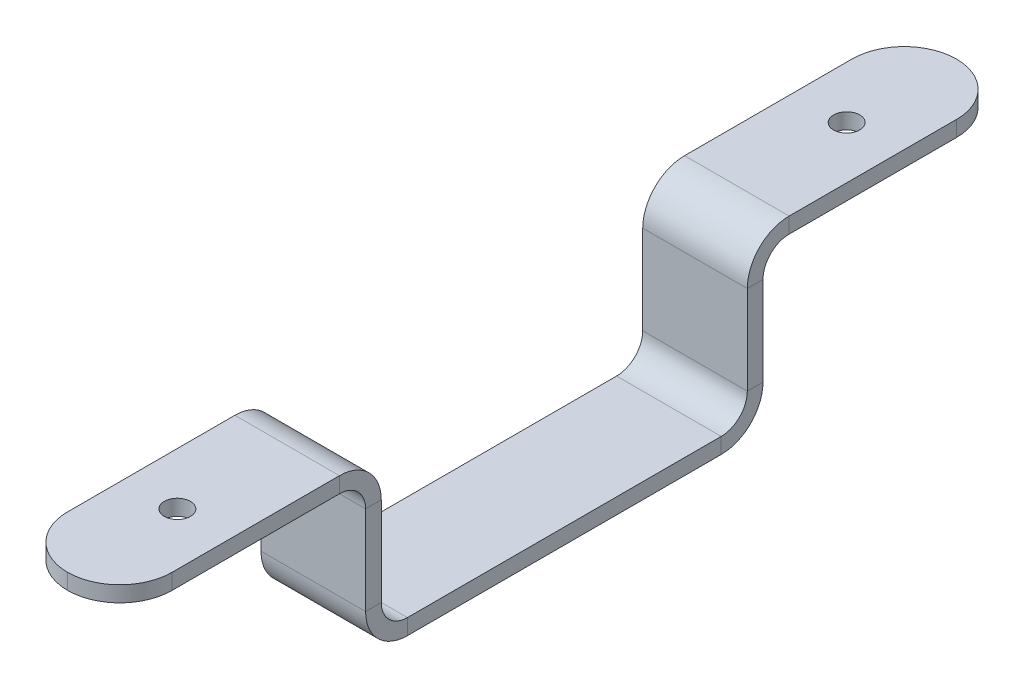
ISO-10303-21;
HEADER;
FILE_DESCRIPTION(('STEP AP214'),'2;1');
FILE_NAME('part.step','',(''),(''),'','','');
FILE_SCHEMA(('AUTOMOTIVE_DESIGN { 1 0 10303 214 1 1 1 1 }'));
ENDSEC;
DATA;
#1=APPLICATION_CONTEXT('core data for automotive mechanical design processes');
#2=APPLICATION_PROTOCOL_DEFINITION('international standard','automotive_design',2000,#1);
#3=PRODUCT_CONTEXT('',#1,'mechanical');
#4=PRODUCT('Part','Part','',(#3));
#5=PRODUCT_RELATED_PRODUCT_CATEGORY('part','',(#4));
#6=PRODUCT_DEFINITION_FORMATION('','',#4);
#7=PRODUCT_DEFINITION_CONTEXT('part definition',#1,'design');
#8=PRODUCT_DEFINITION('design','',#6,#7);
#9=PRODUCT_DEFINITION_SHAPE('','',#8);
#10=(LENGTH_UNIT() NAMED_UNIT(*) SI_UNIT(.MILLI.,.METRE.));
#11=(NAMED_UNIT(*) PLANE_ANGLE_UNIT() SI_UNIT($,.RADIAN.));
#12=(NAMED_UNIT(*) SI_UNIT($,.STERADIAN.) SOLID_ANGLE_UNIT());
#13=UNCERTAINTY_MEASURE_WITH_UNIT(LENGTH_MEASURE(1.E-05),#10,'distance_accuracy_value','');
#14=(GEOMETRIC_REPRESENTATION_CONTEXT(3) GLOBAL_UNCERTAINTY_ASSIGNED_CONTEXT((#13)) GLOBAL_UNIT_ASSIGNED_CONTEXT((#10,
#11,#12)) REPRESENTATION_CONTEXT('',''));
#15=CARTESIAN_POINT('',(0.,0.,0.));
#16=DIRECTION('',(0.,0.,1.));
#17=DIRECTION('',(1.,0.,0.));
#18=AXIS2_PLACEMENT_3D('',#15,#16,#17);
#19=CARTESIAN_POINT('',(20.,-8.,35.));
#20=DIRECTION('',(1.,0.,0.));
#21=DIRECTION('',(0.,0.,-1.));
#22=AXIS2_PLACEMENT_3D('',#19,#20,#21);
#23=PLANE('',#22);
#24=DIRECTION('',(0.,0.,1.));
#25=VECTOR('',#24,1.);
#26=CARTESIAN_POINT('',(20.,-8.,35.));
#27=LINE('',#26,#25);
#28=CARTESIAN_POINT('',(20.,-8.,35.));
#29=VERTEX_POINT('',#28);
#30=CARTESIAN_POINT('',(20.,-8.,38.));
#31=VERTEX_POINT('',#30);
#32=EDGE_CURVE('E389',#29,#31,#27,.T.);
#33=ORIENTED_EDGE('',*,*,#32,.F.);
#34=CARTESIAN_POINT('',(20.,-8.,43.));
#35=DIRECTION('',(1.,0.,0.));
#36=DIRECTION('',(0.,0.,-1.));
#37=AXIS2_PLACEMENT_3D('',#34,#35,#36);
#38=CIRCLE('',#37,8.);
#39=CARTESIAN_POINT('',(20.,0.,43.));
#40=VERTEX_POINT('',#39);
#41=EDGE_CURVE('E243',#40,#29,#38,.F.);
#42=ORIENTED_EDGE('',*,*,#41,.F.);
#43=DIRECTION('',(0.,1.,0.));
#44=VECTOR('',#43,1.);
#45=CARTESIAN_POINT('',(20.,-3.,43.));
#46=LINE('',#45,#44);
#47=CARTESIAN_POINT('',(20.,-3.,43.));
#48=VERTEX_POINT('',#47);
#49=EDGE_CURVE('E386',#48,#40,#46,.T.);
#50=ORIENTED_EDGE('',*,*,#49,.F.);
#51=CARTESIAN_POINT('',(20.,-8.,43.));
#52=DIRECTION('',(1.,0.,0.));
#53=DIRECTION('',(0.,0.,-1.));
#54=AXIS2_PLACEMENT_3D('',#51,#52,#53);
#55=CIRCLE('',#54,5.);
#56=EDGE_CURVE('E250',#48,#31,#55,.F.);
#57=ORIENTED_EDGE('',*,*,#56,.T.);
#58=EDGE_LOOP('',(#33,#42,#50,#57));
#59=FACE_BOUND('',#58,.T.);
#60=ADVANCED_FACE('F37',(#59),#23,.T.);
#61=CARTESIAN_POINT('',(20.,-3.,43.));
#62=DIRECTION('',(1.,0.,0.));
#63=DIRECTION('',(0.,0.,-1.));
#64=AXIS2_PLACEMENT_3D('',#61,#62,#63);
#65=PLANE('',#64);
#66=DIRECTION('',(0.,-1.,0.));
#67=VECTOR('',#66,1.);
#68=CARTESIAN_POINT('',(20.,0.,35.));
#69=LINE('',#68,#67);
#70=CARTESIAN_POINT('',(20.,-25.,35.));
#71=VERTEX_POINT('',#70);
#72=EDGE_CURVE('E240',#29,#71,#69,.T.);
#73=ORIENTED_EDGE('',*,*,#72,.F.);
#74=ORIENTED_EDGE('',*,*,#32,.T.);
#75=DIRECTION('',(0.,1.,0.));
#76=VECTOR('',#75,1.);
#77=CARTESIAN_POINT('',(20.,0.,38.));
#78=LINE('',#77,#76);
#79=CARTESIAN_POINT('',(20.,-25.,38.));
#80=VERTEX_POINT('',#79);
#81=EDGE_CURVE('E253',#31,#80,#78,.F.);
#82=ORIENTED_EDGE('',*,*,#81,.T.);
#83=DIRECTION('',(0.,0.,-1.));
#84=VECTOR('',#83,1.);
#85=CARTESIAN_POINT('',(20.,-25.,38.));
#86=LINE('',#85,#84);
#87=EDGE_CURVE('E377',#80,#71,#86,.T.);
#88=ORIENTED_EDGE('',*,*,#87,.T.);
#89=EDGE_LOOP('',(#73,#74,#82,#88));
#90=FACE_BOUND('',#89,.T.);
#91=ADVANCED_FACE('F446',(#90),#65,.T.);
#92=CARTESIAN_POINT('',(0.,0.,43.));
#93=DIRECTION('',(-1.,0.,0.));
#94=DIRECTION('',(0.,0.,1.));
#95=AXIS2_PLACEMENT_3D('',#92,#93,#94);
#96=PLANE('',#95);
#97=DIRECTION('',(0.,-1.,0.));
#98=VECTOR('',#97,1.);
#99=CARTESIAN_POINT('',(0.,0.,43.));
#100=LINE('',#99,#98);
#101=CARTESIAN_POINT('',(0.,0.,43.));
#102=VERTEX_POINT('',#101);
#103=CARTESIAN_POINT('',(0.,-3.,43.));
#104=VERTEX_POINT('',#103);
#105=EDGE_CURVE('E383',#102,#104,#100,.T.);
#106=ORIENTED_EDGE('',*,*,#105,.F.);
#107=CARTESIAN_POINT('',(0.,-8.,43.));
#108=DIRECTION('',(1.,0.,0.));
#109=DIRECTION('',(0.,0.,-1.));
#110=AXIS2_PLACEMENT_3D('',#107,#108,#109);
#111=CIRCLE('',#110,8.);
#112=CARTESIAN_POINT('',(0.,-8.,35.));
#113=VERTEX_POINT('',#112);
#114=EDGE_CURVE('E292',#102,#113,#111,.F.);
#115=ORIENTED_EDGE('',*,*,#114,.T.);
#116=DIRECTION('',(0.,0.,-1.));
#117=VECTOR('',#116,1.);
#118=CARTESIAN_POINT('',(0.,-8.,38.));
#119=LINE('',#118,#117);
#120=CARTESIAN_POINT('',(0.,-8.,38.));
#121=VERTEX_POINT('',#120);
#122=EDGE_CURVE('E381',#121,#113,#119,.T.);
#123=ORIENTED_EDGE('',*,*,#122,.F.);
#124=CARTESIAN_POINT('',(0.,-8.,43.));
#125=DIRECTION('',(1.,0.,0.));
#126=DIRECTION('',(0.,0.,-1.));
#127=AXIS2_PLACEMENT_3D('',#124,#125,#126);
#128=CIRCLE('',#127,5.);
#129=EDGE_CURVE('E299',#104,#121,#128,.F.);
#130=ORIENTED_EDGE('',*,*,#129,.F.);
#131=EDGE_LOOP('',(#106,#115,#123,#130));
#132=FACE_BOUND('',#131,.T.);
#133=ADVANCED_FACE('F527',(#132),#96,.T.);
#134=CARTESIAN_POINT('',(0.,-8.,38.));
#135=DIRECTION('',(-1.,0.,0.));
#136=DIRECTION('',(0.,0.,1.));
#137=AXIS2_PLACEMENT_3D('',#134,#135,#136);
#138=PLANE('',#137);
#139=DIRECTION('',(0.,0.,-1.));
#140=VECTOR('',#139,1.);
#141=CARTESIAN_POINT('',(0.,-3.,85.));
#142=LINE('',#141,#140);
#143=CARTESIAN_POINT('',(0.,-3.,75.));
#144=VERTEX_POINT('',#143);
#145=EDGE_CURVE('E297',#144,#104,#142,.T.);
#146=ORIENTED_EDGE('',*,*,#145,.F.);
#147=DIRECTION('',(0.,1.,0.));
#148=VECTOR('',#147,1.);
#149=CARTESIAN_POINT('',(0.,-8.,75.));
#150=LINE('',#149,#148);
#151=CARTESIAN_POINT('',(0.,0.,75.));
#152=VERTEX_POINT('',#151);
#153=EDGE_CURVE('E402',#144,#152,#150,.T.);
#154=ORIENTED_EDGE('',*,*,#153,.T.);
#155=DIRECTION('',(0.,0.,-1.));
#156=VECTOR('',#155,1.);
#157=CARTESIAN_POINT('',(0.,0.,85.));
#158=LINE('',#157,#156);
#159=EDGE_CURVE('E295',#152,#102,#158,.T.);
#160=ORIENTED_EDGE('',*,*,#159,.T.);
#161=ORIENTED_EDGE('',*,*,#105,.T.);
#162=EDGE_LOOP('',(#146,#154,#160,#161));
#163=FACE_BOUND('',#162,.T.);
#164=ADVANCED_FACE('F798',(#163),#138,.T.);
#165=CARTESIAN_POINT('',(20.,-30.,30.));
#166=DIRECTION('',(1.,0.,0.));
#167=DIRECTION('',(0.,0.,-1.));
#168=AXIS2_PLACEMENT_3D('',#165,#166,#167);
#169=PLANE('',#168);
#170=DIRECTION('',(0.,-1.,0.));
#171=VECTOR('',#170,1.);
#172=CARTESIAN_POINT('',(20.,-30.,30.));
#173=LINE('',#172,#171);
#174=CARTESIAN_POINT('',(20.,-30.,30.));
#175=VERTEX_POINT('',#174);
#176=CARTESIAN_POINT('',(20.,-33.,30.));
#177=VERTEX_POINT('',#176);
#178=EDGE_CURVE('E379',#175,#177,#173,.T.);
#179=ORIENTED_EDGE('',*,*,#178,.F.);
#180=CARTESIAN_POINT('',(20.,-25.,30.));
#181=DIRECTION('',(-1.,0.,0.));
#182=DIRECTION('',(0.,0.,1.));
#183=AXIS2_PLACEMENT_3D('',#180,#181,#182);
#184=CIRCLE('',#183,5.);
#185=EDGE_CURVE('E237',#71,#175,#184,.F.);
#186=ORIENTED_EDGE('',*,*,#185,.F.);
#187=ORIENTED_EDGE('',*,*,#87,.F.);
#188=CARTESIAN_POINT('',(20.,-25.,30.));
#189=DIRECTION('',(1.,0.,0.));
#190=DIRECTION('',(0.,0.,-1.));
#191=AXIS2_PLACEMENT_3D('',#188,#189,#190);
#192=CIRCLE('',#191,8.);
#193=EDGE_CURVE('E256',#80,#177,#192,.T.);
#194=ORIENTED_EDGE('',*,*,#193,.T.);
#195=EDGE_LOOP('',(#179,#186,#187,#194));
#196=FACE_BOUND('',#195,.T.);
#197=ADVANCED_FACE('F455',(#196),#169,.T.);
#198=CARTESIAN_POINT('',(20.,-25.,38.));
#199=DIRECTION('',(1.,0.,0.));
#200=DIRECTION('',(0.,0.,-1.));
#201=AXIS2_PLACEMENT_3D('',#198,#199,#200);
#202=PLANE('',#201);
#203=DIRECTION('',(0.,0.,-1.));
#204=VECTOR('',#203,1.);
#205=CARTESIAN_POINT('',(20.,-30.,35.));
#206=LINE('',#205,#204);
#207=CARTESIAN_POINT('',(20.,-30.,-30.));
#208=VERTEX_POINT('',#207);
#209=EDGE_CURVE('E234',#175,#208,#206,.T.);
#210=ORIENTED_EDGE('',*,*,#209,.F.);
#211=ORIENTED_EDGE('',*,*,#178,.T.);
#212=DIRECTION('',(0.,0.,-1.));
#213=VECTOR('',#212,1.);
#214=CARTESIAN_POINT('',(20.,-33.,35.));
#215=LINE('',#214,#213);
#216=CARTESIAN_POINT('',(20.,-33.,-30.));
#217=VERTEX_POINT('',#216);
#218=EDGE_CURVE('E259',#177,#217,#215,.T.);
#219=ORIENTED_EDGE('',*,*,#218,.T.);
#220=DIRECTION('',(0.,1.,0.));
#221=VECTOR('',#220,1.);
#222=CARTESIAN_POINT('',(20.,-33.,-30.));
#223=LINE('',#222,#221);
#224=EDGE_CURVE('E369',#217,#208,#223,.T.);
#225=ORIENTED_EDGE('',*,*,#224,.T.);
#226=EDGE_LOOP('',(#210,#211,#219,#225));
#227=FACE_BOUND('',#226,.T.);
#228=ADVANCED_FACE('F464',(#227),#202,.T.);
#229=CARTESIAN_POINT('',(0.,-25.,35.));
#230=DIRECTION('',(-1.,0.,0.));
#231=DIRECTION('',(0.,0.,1.));
#232=AXIS2_PLACEMENT_3D('',#229,#230,#231);
#233=PLANE('',#232);
#234=DIRECTION('',(0.,0.,1.));
#235=VECTOR('',#234,1.);
#236=CARTESIAN_POINT('',(0.,-25.,35.));
#237=LINE('',#236,#235);
#238=CARTESIAN_POINT('',(0.,-25.,35.));
#239=VERTEX_POINT('',#238);
#240=CARTESIAN_POINT('',(0.,-25.,38.));
#241=VERTEX_POINT('',#240);
#242=EDGE_CURVE('E375',#239,#241,#237,.T.);
#243=ORIENTED_EDGE('',*,*,#242,.F.);
#244=CARTESIAN_POINT('',(0.,-25.,30.));
#245=DIRECTION('',(-1.,0.,0.));
#246=DIRECTION('',(0.,0.,1.));
#247=AXIS2_PLACEMENT_3D('',#244,#245,#246);
#248=CIRCLE('',#247,5.);
#249=CARTESIAN_POINT('',(0.,-30.,30.));
#250=VERTEX_POINT('',#249);
#251=EDGE_CURVE('E286',#239,#250,#248,.F.);
#252=ORIENTED_EDGE('',*,*,#251,.T.);
#253=DIRECTION('',(0.,1.,0.));
#254=VECTOR('',#253,1.);
#255=CARTESIAN_POINT('',(0.,-33.,30.));
#256=LINE('',#255,#254);
#257=CARTESIAN_POINT('',(0.,-33.,30.));
#258=VERTEX_POINT('',#257);
#259=EDGE_CURVE('E373',#258,#250,#256,.T.);
#260=ORIENTED_EDGE('',*,*,#259,.F.);
#261=CARTESIAN_POINT('',(0.,-25.,30.));
#262=DIRECTION('',(1.,0.,0.));
#263=DIRECTION('',(0.,0.,-1.));
#264=AXIS2_PLACEMENT_3D('',#261,#262,#263);
#265=CIRCLE('',#264,8.);
#266=EDGE_CURVE('E305',#241,#258,#265,.T.);
#267=ORIENTED_EDGE('',*,*,#266,.F.);
#268=EDGE_LOOP('',(#243,#252,#260,#267));
#269=FACE_BOUND('',#268,.T.);
#270=ADVANCED_FACE('F768',(#269),#233,.T.);
#271=CARTESIAN_POINT('',(0.,-33.,30.));
#272=DIRECTION('',(-1.,0.,0.));
#273=DIRECTION('',(0.,0.,1.));
#274=AXIS2_PLACEMENT_3D('',#271,#272,#273);
#275=PLANE('',#274);
#276=DIRECTION('',(0.,-1.,0.));
#277=VECTOR('',#276,1.);
#278=CARTESIAN_POINT('',(0.,0.,35.));
#279=LINE('',#278,#277);
#280=EDGE_CURVE('E289',#113,#239,#279,.T.);
#281=ORIENTED_EDGE('',*,*,#280,.T.);
#282=ORIENTED_EDGE('',*,*,#242,.T.);
#283=DIRECTION('',(0.,1.,0.));
#284=VECTOR('',#283,1.);
#285=CARTESIAN_POINT('',(0.,0.,38.));
#286=LINE('',#285,#284);
#287=EDGE_CURVE('E302',#121,#241,#286,.F.);
#288=ORIENTED_EDGE('',*,*,#287,.F.);
#289=ORIENTED_EDGE('',*,*,#122,.T.);
#290=EDGE_LOOP('',(#281,#282,#288,#289));
#291=FACE_BOUND('',#290,.T.);
#292=ADVANCED_FACE('F758',(#291),#275,.T.);
#293=CARTESIAN_POINT('',(20.,-25.,-35.));
#294=DIRECTION('',(1.,0.,0.));
#295=DIRECTION('',(0.,0.,-1.));
#296=AXIS2_PLACEMENT_3D('',#293,#294,#295);
#297=PLANE('',#296);
#298=DIRECTION('',(0.,0.,-1.));
#299=VECTOR('',#298,1.);
#300=CARTESIAN_POINT('',(20.,-25.,-35.));
#301=LINE('',#300,#299);
#302=CARTESIAN_POINT('',(20.,-25.,-35.));
#303=VERTEX_POINT('',#302);
#304=CARTESIAN_POINT('',(20.,-25.,-38.));
#305=VERTEX_POINT('',#304);
#306=EDGE_CURVE('E371',#303,#305,#301,.T.);
#307=ORIENTED_EDGE('',*,*,#306,.F.);
#308=CARTESIAN_POINT('',(20.,-25.,-30.));
#309=DIRECTION('',(-1.,0.,0.));
#310=DIRECTION('',(0.,0.,1.));
#311=AXIS2_PLACEMENT_3D('',#308,#309,#310);
#312=CIRCLE('',#311,5.);
#313=EDGE_CURVE('E228',#208,#303,#312,.F.);
#314=ORIENTED_EDGE('',*,*,#313,.F.);
#315=ORIENTED_EDGE('',*,*,#224,.F.);
#316=CARTESIAN_POINT('',(20.,-25.,-30.));
#317=DIRECTION('',(1.,0.,0.));
#318=DIRECTION('',(0.,0.,-1.));
#319=AXIS2_PLACEMENT_3D('',#316,#317,#318);
#320=CIRCLE('',#319,8.);
#321=EDGE_CURVE('E262',#217,#305,#320,.T.);
#322=ORIENTED_EDGE('',*,*,#321,.T.);
#323=EDGE_LOOP('',(#307,#314,#315,#322));
#324=FACE_BOUND('',#323,.T.);
#325=ADVANCED_FACE('F473',(#324),#297,.T.);
#326=CARTESIAN_POINT('',(20.,-33.,-30.));
#327=DIRECTION('',(1.,0.,0.));
#328=DIRECTION('',(0.,0.,-1.));
#329=AXIS2_PLACEMENT_3D('',#326,#327,#328);
#330=PLANE('',#329);
#331=DIRECTION('',(0.,1.,0.));
#332=VECTOR('',#331,1.);
#333=CARTESIAN_POINT('',(20.,-30.,-35.));
#334=LINE('',#333,#332);
#335=CARTESIAN_POINT('',(20.,-8.,-35.));
#336=VERTEX_POINT('',#335);
#337=EDGE_CURVE('E226',#303,#336,#334,.T.);
#338=ORIENTED_EDGE('',*,*,#337,.F.);
#339=ORIENTED_EDGE('',*,*,#306,.T.);
#340=DIRECTION('',(0.,1.,0.));
#341=VECTOR('',#340,1.);
#342=CARTESIAN_POINT('',(20.,-30.,-38.));
#343=LINE('',#342,#341);
#344=CARTESIAN_POINT('',(20.,-8.,-38.));
#345=VERTEX_POINT('',#344);
#346=EDGE_CURVE('E265',#305,#345,#343,.T.);
#347=ORIENTED_EDGE('',*,*,#346,.T.);
#348=DIRECTION('',(0.,0.,1.));
#349=VECTOR('',#348,1.);
#350=CARTESIAN_POINT('',(20.,-8.,-38.));
#351=LINE('',#350,#349);
#352=EDGE_CURVE('E200',#345,#336,#351,.T.);
#353=ORIENTED_EDGE('',*,*,#352,.T.);
#354=EDGE_LOOP('',(#338,#339,#347,#353));
#355=FACE_BOUND('',#354,.T.);
#356=ADVANCED_FACE('F482',(#355),#330,.T.);
#357=CARTESIAN_POINT('',(0.,-30.,-30.));
#358=DIRECTION('',(-1.,0.,0.));
#359=DIRECTION('',(0.,0.,1.));
#360=AXIS2_PLACEMENT_3D('',#357,#358,#359);
#361=PLANE('',#360);
#362=DIRECTION('',(0.,-1.,0.));
#363=VECTOR('',#362,1.);
#364=CARTESIAN_POINT('',(0.,-30.,-30.));
#365=LINE('',#364,#363);
#366=CARTESIAN_POINT('',(0.,-30.,-30.));
#367=VERTEX_POINT('',#366);
#368=CARTESIAN_POINT('',(0.,-33.,-30.));
#369=VERTEX_POINT('',#368);
#370=EDGE_CURVE('E367',#367,#369,#365,.T.);
#371=ORIENTED_EDGE('',*,*,#370,.F.);
#372=CARTESIAN_POINT('',(0.,-25.,-30.));
#373=DIRECTION('',(-1.,0.,0.));
#374=DIRECTION('',(0.,0.,1.));
#375=AXIS2_PLACEMENT_3D('',#372,#373,#374);
#376=CIRCLE('',#375,5.);
#377=CARTESIAN_POINT('',(0.,-25.,-35.));
#378=VERTEX_POINT('',#377);
#379=EDGE_CURVE('E280',#367,#378,#376,.F.);
#380=ORIENTED_EDGE('',*,*,#379,.T.);
#381=DIRECTION('',(0.,0.,1.));
#382=VECTOR('',#381,1.);
#383=CARTESIAN_POINT('',(0.,-25.,-38.));
#384=LINE('',#383,#382);
#385=CARTESIAN_POINT('',(0.,-25.,-38.));
#386=VERTEX_POINT('',#385);
#387=EDGE_CURVE('E199',#386,#378,#384,.T.);
#388=ORIENTED_EDGE('',*,*,#387,.F.);
#389=CARTESIAN_POINT('',(0.,-25.,-30.));
#390=DIRECTION('',(1.,0.,0.));
#391=DIRECTION('',(0.,0.,-1.));
#392=AXIS2_PLACEMENT_3D('',#389,#390,#391);
#393=CIRCLE('',#392,8.);
#394=EDGE_CURVE('E311',#369,#386,#393,.T.);
#395=ORIENTED_EDGE('',*,*,#394,.F.);
#396=EDGE_LOOP('',(#371,#380,#388,#395));
#397=FACE_BOUND('',#396,.T.);
#398=ADVANCED_FACE('F728',(#397),#361,.T.);
#399=CARTESIAN_POINT('',(0.,-25.,-38.));
#400=DIRECTION('',(-1.,0.,0.));
#401=DIRECTION('',(0.,0.,1.));
#402=AXIS2_PLACEMENT_3D('',#399,#400,#401);
#403=PLANE('',#402);
#404=DIRECTION('',(0.,0.,-1.));
#405=VECTOR('',#404,1.);
#406=CARTESIAN_POINT('',(0.,-30.,35.));
#407=LINE('',#406,#405);
#408=EDGE_CURVE('E283',#250,#367,#407,.T.);
#409=ORIENTED_EDGE('',*,*,#408,.T.);
#410=ORIENTED_EDGE('',*,*,#370,.T.);
#411=DIRECTION('',(0.,0.,-1.));
#412=VECTOR('',#411,1.);
#413=CARTESIAN_POINT('',(0.,-33.,35.));
#414=LINE('',#413,#412);
#415=EDGE_CURVE('E308',#258,#369,#414,.T.);
#416=ORIENTED_EDGE('',*,*,#415,.F.);
#417=ORIENTED_EDGE('',*,*,#259,.T.);
#418=EDGE_LOOP('',(#409,#410,#416,#417));
#419=FACE_BOUND('',#418,.T.);
#420=ADVANCED_FACE('F718',(#419),#403,.T.);
#421=CARTESIAN_POINT('',(20.,0.,-43.));
#422=DIRECTION('',(1.,0.,0.));
#423=DIRECTION('',(0.,0.,-1.));
#424=AXIS2_PLACEMENT_3D('',#421,#422,#423);
#425=PLANE('',#424);
#426=DIRECTION('',(0.,-1.,0.));
#427=VECTOR('',#426,1.);
#428=CARTESIAN_POINT('',(20.,0.,-43.));
#429=LINE('',#428,#427);
#430=CARTESIAN_POINT('',(20.,0.,-43.));
#431=VERTEX_POINT('',#430);
#432=CARTESIAN_POINT('',(20.,-3.,-43.));
#433=VERTEX_POINT('',#432);
#434=EDGE_CURVE('E187',#431,#433,#429,.T.);
#435=ORIENTED_EDGE('',*,*,#434,.F.);
#436=CARTESIAN_POINT('',(20.,-8.,-43.));
#437=DIRECTION('',(1.,0.,0.));
#438=DIRECTION('',(0.,0.,-1.));
#439=AXIS2_PLACEMENT_3D('',#436,#437,#438);
#440=CIRCLE('',#439,8.);
#441=EDGE_CURVE('E191',#336,#431,#440,.F.);
#442=ORIENTED_EDGE('',*,*,#441,.F.);
#443=ORIENTED_EDGE('',*,*,#352,.F.);
#444=CARTESIAN_POINT('',(20.,-8.,-43.));
#445=DIRECTION('',(1.,0.,0.));
#446=DIRECTION('',(0.,0.,-1.));
#447=AXIS2_PLACEMENT_3D('',#444,#445,#446);
#448=CIRCLE('',#447,5.);
#449=EDGE_CURVE('E194',#345,#433,#448,.F.);
#450=ORIENTED_EDGE('',*,*,#449,.T.);
#451=EDGE_LOOP('',(#435,#442,#443,#450));
#452=FACE_BOUND('',#451,.T.);
#453=ADVANCED_FACE('F189',(#452),#425,.T.);
#454=CARTESIAN_POINT('',(20.,-8.,-38.));
#455=DIRECTION('',(1.,0.,0.));
#456=DIRECTION('',(0.,0.,-1.));
#457=AXIS2_PLACEMENT_3D('',#454,#455,#456);
#458=PLANE('',#457);
#459=DIRECTION('',(0.,0.,-1.));
#460=VECTOR('',#459,1.);
#461=CARTESIAN_POINT('',(20.,-3.,-35.));
#462=LINE('',#461,#460);
#463=CARTESIAN_POINT('',(20.,-3.,-75.));
#464=VERTEX_POINT('',#463);
#465=EDGE_CURVE('E221',#433,#464,#462,.T.);
#466=ORIENTED_EDGE('',*,*,#465,.T.);
#467=DIRECTION('',(0.,-1.,0.));
#468=VECTOR('',#467,1.);
#469=CARTESIAN_POINT('',(20.,-8.,-75.));
#470=LINE('',#469,#468);
#471=CARTESIAN_POINT('',(20.,0.,-75.));
#472=VERTEX_POINT('',#471);
#473=EDGE_CURVE('E220',#464,#472,#470,.F.);
#474=ORIENTED_EDGE('',*,*,#473,.T.);
#475=DIRECTION('',(0.,0.,-1.));
#476=VECTOR('',#475,1.);
#477=CARTESIAN_POINT('',(20.,0.,-35.));
#478=LINE('',#477,#476);
#479=EDGE_CURVE('E208',#431,#472,#478,.T.);
#480=ORIENTED_EDGE('',*,*,#479,.F.);
#481=ORIENTED_EDGE('',*,*,#434,.T.);
#482=EDGE_LOOP('',(#466,#474,#480,#481));
#483=FACE_BOUND('',#482,.T.);
#484=ADVANCED_FACE('F218',(#483),#458,.T.);
#485=CARTESIAN_POINT('',(0.,-8.,-35.));
#486=DIRECTION('',(-1.,0.,0.));
#487=DIRECTION('',(0.,0.,1.));
#488=AXIS2_PLACEMENT_3D('',#485,#486,#487);
#489=PLANE('',#488);
#490=DIRECTION('',(0.,0.,-1.));
#491=VECTOR('',#490,1.);
#492=CARTESIAN_POINT('',(0.,-8.,-35.));
#493=LINE('',#492,#491);
#494=CARTESIAN_POINT('',(0.,-8.,-35.));
#495=VERTEX_POINT('',#494);
#496=CARTESIAN_POINT('',(0.,-8.,-38.));
#497=VERTEX_POINT('',#496);
#498=EDGE_CURVE('E363',#495,#497,#493,.T.);
#499=ORIENTED_EDGE('',*,*,#498,.F.);
#500=CARTESIAN_POINT('',(0.,-8.,-43.));
#501=DIRECTION('',(1.,0.,0.));
#502=DIRECTION('',(0.,0.,-1.));
#503=AXIS2_PLACEMENT_3D('',#500,#501,#502);
#504=CIRCLE('',#503,8.);
#505=CARTESIAN_POINT('',(0.,0.,-43.));
#506=VERTEX_POINT('',#505);
#507=EDGE_CURVE('E275',#495,#506,#504,.F.);
#508=ORIENTED_EDGE('',*,*,#507,.T.);
#509=DIRECTION('',(0.,1.,0.));
#510=VECTOR('',#509,1.);
#511=CARTESIAN_POINT('',(0.,-3.,-43.));
#512=LINE('',#511,#510);
#513=CARTESIAN_POINT('',(0.,-3.,-43.));
#514=VERTEX_POINT('',#513);
#515=EDGE_CURVE('E214',#514,#506,#512,.T.);
#516=ORIENTED_EDGE('',*,*,#515,.F.);
#517=CARTESIAN_POINT('',(0.,-8.,-43.));
#518=DIRECTION('',(1.,0.,0.));
#519=DIRECTION('',(0.,0.,-1.));
#520=AXIS2_PLACEMENT_3D('',#517,#518,#519);
#521=CIRCLE('',#520,5.);
#522=EDGE_CURVE('E317',#497,#514,#521,.F.);
#523=ORIENTED_EDGE('',*,*,#522,.F.);
#524=EDGE_LOOP('',(#499,#508,#516,#523));
#525=FACE_BOUND('',#524,.T.);
#526=ADVANCED_FACE('F694',(#525),#489,.T.);
#527=CARTESIAN_POINT('',(0.,-3.,-43.));
#528=DIRECTION('',(-1.,0.,0.));
#529=DIRECTION('',(0.,0.,1.));
#530=AXIS2_PLACEMENT_3D('',#527,#528,#529);
#531=PLANE('',#530);
#532=DIRECTION('',(0.,1.,0.));
#533=VECTOR('',#532,1.);
#534=CARTESIAN_POINT('',(0.,-30.,-35.));
#535=LINE('',#534,#533);
#536=EDGE_CURVE('E277',#378,#495,#535,.T.);
#537=ORIENTED_EDGE('',*,*,#536,.T.);
#538=ORIENTED_EDGE('',*,*,#498,.T.);
#539=DIRECTION('',(0.,1.,0.));
#540=VECTOR('',#539,1.);
#541=CARTESIAN_POINT('',(0.,-30.,-38.));
#542=LINE('',#541,#540);
#543=EDGE_CURVE('E314',#386,#497,#542,.T.);
#544=ORIENTED_EDGE('',*,*,#543,.F.);
#545=ORIENTED_EDGE('',*,*,#387,.T.);
#546=EDGE_LOOP('',(#537,#538,#544,#545));
#547=FACE_BOUND('',#546,.T.);
#548=ADVANCED_FACE('F520',(#547),#531,.T.);
#549=CARTESIAN_POINT('',(20.,-3.,-35.));
#550=DIRECTION('',(0.,1.,0.));
#551=DIRECTION('',(0.,0.,1.));
#552=AXIS2_PLACEMENT_3D('',#549,#550,#551);
#553=PLANE('',#552);
#554=CARTESIAN_POINT('',(10.,-3.,-64.));
#555=DIRECTION('',(0.,1.,0.));
#556=DIRECTION('',(0.,0.,1.));
#557=AXIS2_PLACEMENT_3D('',#554,#555,#556);
#558=CIRCLE('',#557,2.5);
#559=CARTESIAN_POINT('',(10.,-3.,-61.5));
#560=VERTEX_POINT('',#559);
#561=EDGE_CURVE('E273',#560,#560,#558,.T.);
#562=ORIENTED_EDGE('',*,*,#561,.T.);
#563=EDGE_LOOP('',(#562));
#564=FACE_BOUND('',#563,.T.);
#565=CARTESIAN_POINT('',(10.,-3.,-75.));
#566=DIRECTION('',(0.,1.,0.));
#567=DIRECTION('',(0.,0.,1.));
#568=AXIS2_PLACEMENT_3D('',#565,#566,#567);
#569=CIRCLE('',#568,10.);
#570=CARTESIAN_POINT('',(0.,-3.,-75.));
#571=VERTEX_POINT('',#570);
#572=CARTESIAN_POINT('',(10.,-3.,-85.));
#573=VERTEX_POINT('',#572);
#574=EDGE_CURVE('E391',#571,#573,#569,.F.);
#575=ORIENTED_EDGE('',*,*,#574,.T.);
#576=CARTESIAN_POINT('',(10.,-3.,-75.));
#577=DIRECTION('',(0.,1.,0.));
#578=DIRECTION('',(0.,0.,1.));
#579=AXIS2_PLACEMENT_3D('',#576,#577,#578);
#580=CIRCLE('',#579,10.);
#581=EDGE_CURVE('E393',#573,#464,#580,.F.);
#582=ORIENTED_EDGE('',*,*,#581,.T.);
#583=ORIENTED_EDGE('',*,*,#465,.F.);
#584=DIRECTION('',(-1.,0.,0.));
#585=VECTOR('',#584,1.);
#586=CARTESIAN_POINT('',(20.,-3.,-43.));
#587=LINE('',#586,#585);
#588=EDGE_CURVE('E269',#433,#514,#587,.T.);
#589=ORIENTED_EDGE('',*,*,#588,.T.);
#590=DIRECTION('',(0.,0.,-1.));
#591=VECTOR('',#590,1.);
#592=CARTESIAN_POINT('',(0.,-3.,-35.));
#593=LINE('',#592,#591);
#594=EDGE_CURVE('E270',#514,#571,#593,.T.);
#595=ORIENTED_EDGE('',*,*,#594,.T.);
#596=EDGE_LOOP('',(#575,#582,#583,#589,#595));
#597=FACE_BOUND('',#596,.T.);
#598=ADVANCED_FACE('F494',(#564,#597),#553,.F.);
#599=CARTESIAN_POINT('',(20.,0.,-35.));
#600=DIRECTION('',(0.,1.,0.));
#601=DIRECTION('',(0.,0.,1.));
#602=AXIS2_PLACEMENT_3D('',#599,#600,#601);
#603=PLANE('',#602);
#604=CARTESIAN_POINT('',(10.,0.,-64.));
#605=DIRECTION('',(0.,1.,0.));
#606=DIRECTION('',(0.,0.,1.));
#607=AXIS2_PLACEMENT_3D('',#604,#605,#606);
#608=CIRCLE('',#607,2.5);
#609=CARTESIAN_POINT('',(10.,0.,-61.5));
#610=VERTEX_POINT('',#609);
#611=EDGE_CURVE('E498',#610,#610,#608,.T.);
#612=ORIENTED_EDGE('',*,*,#611,.F.);
#613=EDGE_LOOP('',(#612));
#614=FACE_BOUND('',#613,.T.);
#615=ORIENTED_EDGE('',*,*,#479,.T.);
#616=CARTESIAN_POINT('',(10.,0.,-75.));
#617=DIRECTION('',(0.,1.,0.));
#618=DIRECTION('',(0.,0.,1.));
#619=AXIS2_PLACEMENT_3D('',#616,#617,#618);
#620=CIRCLE('',#619,10.);
#621=CARTESIAN_POINT('',(10.,0.,-85.));
#622=VERTEX_POINT('',#621);
#623=EDGE_CURVE('E398',#472,#622,#620,.T.);
#624=ORIENTED_EDGE('',*,*,#623,.T.);
#625=CARTESIAN_POINT('',(10.,0.,-75.));
#626=DIRECTION('',(0.,1.,0.));
#627=DIRECTION('',(0.,0.,1.));
#628=AXIS2_PLACEMENT_3D('',#625,#626,#627);
#629=CIRCLE('',#628,10.);
#630=CARTESIAN_POINT('',(0.,0.,-75.));
#631=VERTEX_POINT('',#630);
#632=EDGE_CURVE('E396',#622,#631,#629,.T.);
#633=ORIENTED_EDGE('',*,*,#632,.T.);
#634=DIRECTION('',(0.,0.,-1.));
#635=VECTOR('',#634,1.);
#636=CARTESIAN_POINT('',(0.,0.,-35.));
#637=LINE('',#636,#635);
#638=EDGE_CURVE('E210',#506,#631,#637,.T.);
#639=ORIENTED_EDGE('',*,*,#638,.F.);
#640=DIRECTION('',(-1.,0.,0.));
#641=VECTOR('',#640,1.);
#642=CARTESIAN_POINT('',(20.,0.,-43.));
#643=LINE('',#642,#641);
#644=EDGE_CURVE('E206',#431,#506,#643,.T.);
#645=ORIENTED_EDGE('',*,*,#644,.F.);
#646=EDGE_LOOP('',(#615,#624,#633,#639,#645));
#647=FACE_BOUND('',#646,.T.);
#648=ADVANCED_FACE('F207',(#614,#647),#603,.T.);
#649=CARTESIAN_POINT('',(20.,-8.,-43.));
#650=DIRECTION('',(-1.,0.,0.));
#651=DIRECTION('',(0.,0.,1.));
#652=AXIS2_PLACEMENT_3D('',#649,#650,#651);
#653=CYLINDRICAL_SURFACE('',#652,8.);
#654=ORIENTED_EDGE('',*,*,#507,.F.);
#655=DIRECTION('',(-1.,0.,0.));
#656=VECTOR('',#655,1.);
#657=CARTESIAN_POINT('',(20.,-8.,-35.));
#658=LINE('',#657,#656);
#659=EDGE_CURVE('E215',#336,#495,#658,.T.);
#660=ORIENTED_EDGE('',*,*,#659,.F.);
#661=ORIENTED_EDGE('',*,*,#441,.T.);
#662=ORIENTED_EDGE('',*,*,#644,.T.);
#663=EDGE_LOOP('',(#654,#660,#661,#662));
#664=FACE_BOUND('',#663,.T.);
#665=ADVANCED_FACE('F224',(#664),#653,.T.);
#666=CARTESIAN_POINT('',(20.,-30.,-35.));
#667=DIRECTION('',(0.,0.,1.));
#668=DIRECTION('',(0.,-1.,0.));
#669=AXIS2_PLACEMENT_3D('',#666,#667,#668);
#670=PLANE('',#669);
#671=ORIENTED_EDGE('',*,*,#536,.F.);
#672=DIRECTION('',(-1.,0.,0.));
#673=VECTOR('',#672,1.);
#674=CARTESIAN_POINT('',(20.,-25.,-35.));
#675=LINE('',#674,#673);
#676=EDGE_CURVE('E358',#303,#378,#675,.T.);
#677=ORIENTED_EDGE('',*,*,#676,.F.);
#678=ORIENTED_EDGE('',*,*,#337,.T.);
#679=ORIENTED_EDGE('',*,*,#659,.T.);
#680=EDGE_LOOP('',(#671,#677,#678,#679));
#681=FACE_BOUND('',#680,.T.);
#682=ADVANCED_FACE('F481',(#681),#670,.T.);
#683=CARTESIAN_POINT('',(20.,-25.,-30.));
#684=DIRECTION('',(-1.,0.,0.));
#685=DIRECTION('',(0.,0.,1.));
#686=AXIS2_PLACEMENT_3D('',#683,#684,#685);
#687=CYLINDRICAL_SURFACE('',#686,5.);
#688=ORIENTED_EDGE('',*,*,#379,.F.);
#689=DIRECTION('',(-1.,0.,0.));
#690=VECTOR('',#689,1.);
#691=CARTESIAN_POINT('',(20.,-30.,-30.));
#692=LINE('',#691,#690);
#693=EDGE_CURVE('E355',#208,#367,#692,.T.);
#694=ORIENTED_EDGE('',*,*,#693,.F.);
#695=ORIENTED_EDGE('',*,*,#313,.T.);
#696=ORIENTED_EDGE('',*,*,#676,.T.);
#697=EDGE_LOOP('',(#688,#694,#695,#696));
#698=FACE_BOUND('',#697,.T.);
#699=ADVANCED_FACE('F472',(#698),#687,.F.);
#700=CARTESIAN_POINT('',(20.,-30.,35.));
#701=DIRECTION('',(0.,1.,0.));
#702=DIRECTION('',(0.,0.,1.));
#703=AXIS2_PLACEMENT_3D('',#700,#701,#702);
#704=PLANE('',#703);
#705=ORIENTED_EDGE('',*,*,#408,.F.);
#706=DIRECTION('',(-1.,0.,0.));
#707=VECTOR('',#706,1.);
#708=CARTESIAN_POINT('',(20.,-30.,30.));
#709=LINE('',#708,#707);
#710=EDGE_CURVE('E352',#175,#250,#709,.T.);
#711=ORIENTED_EDGE('',*,*,#710,.F.);
#712=ORIENTED_EDGE('',*,*,#209,.T.);
#713=ORIENTED_EDGE('',*,*,#693,.T.);
#714=EDGE_LOOP('',(#705,#711,#712,#713));
#715=FACE_BOUND('',#714,.T.);
#716=ADVANCED_FACE('F463',(#715),#704,.T.);
#717=CARTESIAN_POINT('',(20.,-25.,30.));
#718=DIRECTION('',(-1.,0.,0.));
#719=DIRECTION('',(0.,0.,1.));
#720=AXIS2_PLACEMENT_3D('',#717,#718,#719);
#721=CYLINDRICAL_SURFACE('',#720,5.);
#722=ORIENTED_EDGE('',*,*,#251,.F.);
#723=DIRECTION('',(-1.,0.,0.));
#724=VECTOR('',#723,1.);
#725=CARTESIAN_POINT('',(20.,-25.,35.));
#726=LINE('',#725,#724);
#727=EDGE_CURVE('E349',#71,#239,#726,.T.);
#728=ORIENTED_EDGE('',*,*,#727,.F.);
#729=ORIENTED_EDGE('',*,*,#185,.T.);
#730=ORIENTED_EDGE('',*,*,#710,.T.);
#731=EDGE_LOOP('',(#722,#728,#729,#730));
#732=FACE_BOUND('',#731,.T.);
#733=ADVANCED_FACE('F454',(#732),#721,.F.);
#734=CARTESIAN_POINT('',(20.,0.,35.));
#735=DIRECTION('',(0.,0.,-1.));
#736=DIRECTION('',(-1.,0.,0.));
#737=AXIS2_PLACEMENT_3D('',#734,#735,#736);
#738=PLANE('',#737);
#739=ORIENTED_EDGE('',*,*,#280,.F.);
#740=DIRECTION('',(-1.,0.,0.));
#741=VECTOR('',#740,1.);
#742=CARTESIAN_POINT('',(20.,-8.,35.));
#743=LINE('',#742,#741);
#744=EDGE_CURVE('E346',#29,#113,#743,.T.);
#745=ORIENTED_EDGE('',*,*,#744,.F.);
#746=ORIENTED_EDGE('',*,*,#72,.T.);
#747=ORIENTED_EDGE('',*,*,#727,.T.);
#748=EDGE_LOOP('',(#739,#745,#746,#747));
#749=FACE_BOUND('',#748,.T.);
#750=ADVANCED_FACE('F445',(#749),#738,.T.);
#751=CARTESIAN_POINT('',(20.,-8.,43.));
#752=DIRECTION('',(-1.,0.,0.));
#753=DIRECTION('',(0.,0.,1.));
#754=AXIS2_PLACEMENT_3D('',#751,#752,#753);
#755=CYLINDRICAL_SURFACE('',#754,8.);
#756=ORIENTED_EDGE('',*,*,#114,.F.);
#757=DIRECTION('',(-1.,0.,0.));
#758=VECTOR('',#757,1.);
#759=CARTESIAN_POINT('',(20.,0.,43.));
#760=LINE('',#759,#758);
#761=EDGE_CURVE('E343',#40,#102,#760,.T.);
#762=ORIENTED_EDGE('',*,*,#761,.F.);
#763=ORIENTED_EDGE('',*,*,#41,.T.);
#764=ORIENTED_EDGE('',*,*,#744,.T.);
#765=EDGE_LOOP('',(#756,#762,#763,#764));
#766=FACE_BOUND('',#765,.T.);
#767=ADVANCED_FACE('F437',(#766),#755,.T.);
#768=CARTESIAN_POINT('',(20.,0.,85.));
#769=DIRECTION('',(0.,1.,0.));
#770=DIRECTION('',(0.,0.,1.));
#771=AXIS2_PLACEMENT_3D('',#768,#769,#770);
#772=PLANE('',#771);
#773=CARTESIAN_POINT('',(10.,0.,64.));
#774=DIRECTION('',(0.,1.,0.));
#775=DIRECTION('',(0.,0.,-1.));
#776=AXIS2_PLACEMENT_3D('',#773,#774,#775);
#777=CIRCLE('',#776,2.5);
#778=CARTESIAN_POINT('',(10.,0.,61.5));
#779=VERTEX_POINT('',#778);
#780=EDGE_CURVE('E412',#779,#779,#777,.T.);
#781=ORIENTED_EDGE('',*,*,#780,.F.);
#782=EDGE_LOOP('',(#781));
#783=FACE_BOUND('',#782,.T.);
#784=ORIENTED_EDGE('',*,*,#159,.F.);
#785=CARTESIAN_POINT('',(10.,0.,75.));
#786=DIRECTION('',(0.,1.,0.));
#787=DIRECTION('',(0.,0.,1.));
#788=AXIS2_PLACEMENT_3D('',#785,#786,#787);
#789=CIRCLE('',#788,10.);
#790=CARTESIAN_POINT('',(10.,0.,85.));
#791=VERTEX_POINT('',#790);
#792=EDGE_CURVE('E407',#152,#791,#789,.T.);
#793=ORIENTED_EDGE('',*,*,#792,.T.);
#794=CARTESIAN_POINT('',(10.,0.,75.));
#795=DIRECTION('',(0.,1.,0.));
#796=DIRECTION('',(0.,0.,1.));
#797=AXIS2_PLACEMENT_3D('',#794,#795,#796);
#798=CIRCLE('',#797,10.);
#799=CARTESIAN_POINT('',(20.,0.,75.));
#800=VERTEX_POINT('',#799);
#801=EDGE_CURVE('E405',#791,#800,#798,.T.);
#802=ORIENTED_EDGE('',*,*,#801,.T.);
#803=DIRECTION('',(0.,0.,-1.));
#804=VECTOR('',#803,1.);
#805=CARTESIAN_POINT('',(20.,0.,85.));
#806=LINE('',#805,#804);
#807=EDGE_CURVE('E246',#800,#40,#806,.T.);
#808=ORIENTED_EDGE('',*,*,#807,.T.);
#809=ORIENTED_EDGE('',*,*,#761,.T.);
#810=EDGE_LOOP('',(#784,#793,#802,#808,#809));
#811=FACE_BOUND('',#810,.T.);
#812=ADVANCED_FACE('F428',(#783,#811),#772,.T.);
#813=CARTESIAN_POINT('',(20.,-3.,85.));
#814=DIRECTION('',(0.,1.,0.));
#815=DIRECTION('',(0.,0.,1.));
#816=AXIS2_PLACEMENT_3D('',#813,#814,#815);
#817=PLANE('',#816);
#818=CARTESIAN_POINT('',(10.,-3.,64.));
#819=DIRECTION('',(0.,1.,0.));
#820=DIRECTION('',(0.,0.,-1.));
#821=AXIS2_PLACEMENT_3D('',#818,#819,#820);
#822=CIRCLE('',#821,2.5);
#823=CARTESIAN_POINT('',(10.,-3.,61.5));
#824=VERTEX_POINT('',#823);
#825=EDGE_CURVE('E417',#824,#824,#822,.T.);
#826=ORIENTED_EDGE('',*,*,#825,.T.);
#827=EDGE_LOOP('',(#826));
#828=FACE_BOUND('',#827,.T.);
#829=CARTESIAN_POINT('',(10.,-3.,75.));
#830=DIRECTION('',(0.,1.,0.));
#831=DIRECTION('',(0.,0.,1.));
#832=AXIS2_PLACEMENT_3D('',#829,#830,#831);
#833=CIRCLE('',#832,10.);
#834=CARTESIAN_POINT('',(20.,-3.,75.));
#835=VERTEX_POINT('',#834);
#836=CARTESIAN_POINT('',(10.,-3.,85.));
#837=VERTEX_POINT('',#836);
#838=EDGE_CURVE('E54',#835,#837,#833,.F.);
#839=ORIENTED_EDGE('',*,*,#838,.T.);
#840=CARTESIAN_POINT('',(10.,-3.,75.));
#841=DIRECTION('',(0.,1.,0.));
#842=DIRECTION('',(0.,0.,1.));
#843=AXIS2_PLACEMENT_3D('',#840,#841,#842);
#844=CIRCLE('',#843,10.);
#845=EDGE_CURVE('E46',#837,#144,#844,.F.);
#846=ORIENTED_EDGE('',*,*,#845,.T.);
#847=ORIENTED_EDGE('',*,*,#145,.T.);
#848=DIRECTION('',(-1.,0.,0.));
#849=VECTOR('',#848,1.);
#850=CARTESIAN_POINT('',(20.,-3.,43.));
#851=LINE('',#850,#849);
#852=EDGE_CURVE('E340',#48,#104,#851,.T.);
#853=ORIENTED_EDGE('',*,*,#852,.F.);
#854=DIRECTION('',(0.,0.,-1.));
#855=VECTOR('',#854,1.);
#856=CARTESIAN_POINT('',(20.,-3.,85.));
#857=LINE('',#856,#855);
#858=EDGE_CURVE('E248',#835,#48,#857,.T.);
#859=ORIENTED_EDGE('',*,*,#858,.F.);
#860=EDGE_LOOP('',(#839,#846,#847,#853,#859));
#861=FACE_BOUND('',#860,.T.);
#862=ADVANCED_FACE('F628',(#828,#861),#817,.F.);
#863=CARTESIAN_POINT('',(20.,-8.,43.));
#864=DIRECTION('',(-1.,0.,0.));
#865=DIRECTION('',(0.,0.,1.));
#866=AXIS2_PLACEMENT_3D('',#863,#864,#865);
#867=CYLINDRICAL_SURFACE('',#866,5.);
#868=ORIENTED_EDGE('',*,*,#129,.T.);
#869=DIRECTION('',(-1.,0.,0.));
#870=VECTOR('',#869,1.);
#871=CARTESIAN_POINT('',(20.,-8.,38.));
#872=LINE('',#871,#870);
#873=EDGE_CURVE('E337',#31,#121,#872,.T.);
#874=ORIENTED_EDGE('',*,*,#873,.F.);
#875=ORIENTED_EDGE('',*,*,#56,.F.);
#876=ORIENTED_EDGE('',*,*,#852,.T.);
#877=EDGE_LOOP('',(#868,#874,#875,#876));
#878=FACE_BOUND('',#877,.T.);
#879=ADVANCED_FACE('F620',(#878),#867,.F.);
#880=CARTESIAN_POINT('',(20.,0.,38.));
#881=DIRECTION('',(0.,0.,-1.));
#882=DIRECTION('',(-1.,0.,0.));
#883=AXIS2_PLACEMENT_3D('',#880,#881,#882);
#884=PLANE('',#883);
#885=ORIENTED_EDGE('',*,*,#287,.T.);
#886=DIRECTION('',(-1.,0.,0.));
#887=VECTOR('',#886,1.);
#888=CARTESIAN_POINT('',(20.,-25.,38.));
#889=LINE('',#888,#887);
#890=EDGE_CURVE('E334',#80,#241,#889,.T.);
#891=ORIENTED_EDGE('',*,*,#890,.F.);
#892=ORIENTED_EDGE('',*,*,#81,.F.);
#893=ORIENTED_EDGE('',*,*,#873,.T.);
#894=EDGE_LOOP('',(#885,#891,#892,#893));
#895=FACE_BOUND('',#894,.T.);
#896=ADVANCED_FACE('F612',(#895),#884,.F.);
#897=CARTESIAN_POINT('',(20.,-25.,30.));
#898=DIRECTION('',(-1.,0.,0.));
#899=DIRECTION('',(0.,0.,1.));
#900=AXIS2_PLACEMENT_3D('',#897,#898,#899);
#901=CYLINDRICAL_SURFACE('',#900,8.);
#902=ORIENTED_EDGE('',*,*,#266,.T.);
#903=DIRECTION('',(-1.,0.,0.));
#904=VECTOR('',#903,1.);
#905=CARTESIAN_POINT('',(20.,-33.,30.));
#906=LINE('',#905,#904);
#907=EDGE_CURVE('E331',#177,#258,#906,.T.);
#908=ORIENTED_EDGE('',*,*,#907,.F.);
#909=ORIENTED_EDGE('',*,*,#193,.F.);
#910=ORIENTED_EDGE('',*,*,#890,.T.);
#911=EDGE_LOOP('',(#902,#908,#909,#910));
#912=FACE_BOUND('',#911,.T.);
#913=ADVANCED_FACE('F604',(#912),#901,.T.);
#914=CARTESIAN_POINT('',(20.,-33.,35.));
#915=DIRECTION('',(0.,1.,0.));
#916=DIRECTION('',(0.,0.,1.));
#917=AXIS2_PLACEMENT_3D('',#914,#915,#916);
#918=PLANE('',#917);
#919=ORIENTED_EDGE('',*,*,#415,.T.);
#920=DIRECTION('',(-1.,0.,0.));
#921=VECTOR('',#920,1.);
#922=CARTESIAN_POINT('',(20.,-33.,-30.));
#923=LINE('',#922,#921);
#924=EDGE_CURVE('E328',#217,#369,#923,.T.);
#925=ORIENTED_EDGE('',*,*,#924,.F.);
#926=ORIENTED_EDGE('',*,*,#218,.F.);
#927=ORIENTED_EDGE('',*,*,#907,.T.);
#928=EDGE_LOOP('',(#919,#925,#926,#927));
#929=FACE_BOUND('',#928,.T.);
#930=ADVANCED_FACE('F596',(#929),#918,.F.);
#931=CARTESIAN_POINT('',(20.,-25.,-30.));
#932=DIRECTION('',(-1.,0.,0.));
#933=DIRECTION('',(0.,0.,1.));
#934=AXIS2_PLACEMENT_3D('',#931,#932,#933);
#935=CYLINDRICAL_SURFACE('',#934,8.);
#936=ORIENTED_EDGE('',*,*,#394,.T.);
#937=DIRECTION('',(-1.,0.,0.));
#938=VECTOR('',#937,1.);
#939=CARTESIAN_POINT('',(20.,-25.,-38.));
#940=LINE('',#939,#938);
#941=EDGE_CURVE('E325',#305,#386,#940,.T.);
#942=ORIENTED_EDGE('',*,*,#941,.F.);
#943=ORIENTED_EDGE('',*,*,#321,.F.);
#944=ORIENTED_EDGE('',*,*,#924,.T.);
#945=EDGE_LOOP('',(#936,#942,#943,#944));
#946=FACE_BOUND('',#945,.T.);
#947=ADVANCED_FACE('F589',(#946),#935,.T.);
#948=CARTESIAN_POINT('',(20.,-30.,-38.));
#949=DIRECTION('',(0.,0.,1.));
#950=DIRECTION('',(0.,-1.,0.));
#951=AXIS2_PLACEMENT_3D('',#948,#949,#950);
#952=PLANE('',#951);
#953=ORIENTED_EDGE('',*,*,#543,.T.);
#954=DIRECTION('',(-1.,0.,0.));
#955=VECTOR('',#954,1.);
#956=CARTESIAN_POINT('',(20.,-8.,-38.));
#957=LINE('',#956,#955);
#958=EDGE_CURVE('E322',#345,#497,#957,.T.);
#959=ORIENTED_EDGE('',*,*,#958,.F.);
#960=ORIENTED_EDGE('',*,*,#346,.F.);
#961=ORIENTED_EDGE('',*,*,#941,.T.);
#962=EDGE_LOOP('',(#953,#959,#960,#961));
#963=FACE_BOUND('',#962,.T.);
#964=ADVANCED_FACE('F486',(#963),#952,.F.);
#965=CARTESIAN_POINT('',(20.,-8.,-43.));
#966=DIRECTION('',(-1.,0.,0.));
#967=DIRECTION('',(0.,0.,1.));
#968=AXIS2_PLACEMENT_3D('',#965,#966,#967);
#969=CYLINDRICAL_SURFACE('',#968,5.);
#970=ORIENTED_EDGE('',*,*,#522,.T.);
#971=ORIENTED_EDGE('',*,*,#588,.F.);
#972=ORIENTED_EDGE('',*,*,#449,.F.);
#973=ORIENTED_EDGE('',*,*,#958,.T.);
#974=EDGE_LOOP('',(#970,#971,#972,#973));
#975=FACE_BOUND('',#974,.T.);
#976=ADVANCED_FACE('F490',(#975),#969,.F.);
#977=CARTESIAN_POINT('',(20.,-8.,-43.));
#978=DIRECTION('',(1.,0.,0.));
#979=DIRECTION('',(0.,0.,-1.));
#980=AXIS2_PLACEMENT_3D('',#977,#978,#979);
#981=PLANE('',#980);
#982=ORIENTED_EDGE('',*,*,#807,.F.);
#983=DIRECTION('',(0.,1.,0.));
#984=VECTOR('',#983,1.);
#985=CARTESIAN_POINT('',(20.,-8.,75.));
#986=LINE('',#985,#984);
#987=EDGE_CURVE('E11',#800,#835,#986,.F.);
#988=ORIENTED_EDGE('',*,*,#987,.T.);
#989=ORIENTED_EDGE('',*,*,#858,.T.);
#990=ORIENTED_EDGE('',*,*,#49,.T.);
#991=EDGE_LOOP('',(#982,#988,#989,#990));
#992=FACE_BOUND('',#991,.T.);
#993=ADVANCED_FACE('F429',(#992),#981,.T.);
#994=CARTESIAN_POINT('',(0.,-8.,-43.));
#995=DIRECTION('',(1.,0.,0.));
#996=DIRECTION('',(0.,0.,-1.));
#997=AXIS2_PLACEMENT_3D('',#994,#995,#996);
#998=PLANE('',#997);
#999=ORIENTED_EDGE('',*,*,#638,.T.);
#1000=DIRECTION('',(0.,-1.,0.));
#1001=VECTOR('',#1000,1.);
#1002=CARTESIAN_POINT('',(0.,-3.,-75.));
#1003=LINE('',#1002,#1001);
#1004=EDGE_CURVE('E400',#631,#571,#1003,.T.);
#1005=ORIENTED_EDGE('',*,*,#1004,.T.);
#1006=ORIENTED_EDGE('',*,*,#594,.F.);
#1007=ORIENTED_EDGE('',*,*,#515,.T.);
#1008=EDGE_LOOP('',(#999,#1005,#1006,#1007));
#1009=FACE_BOUND('',#1008,.T.);
#1010=ADVANCED_FACE('F562',(#1009),#998,.F.);
#1011=CARTESIAN_POINT('',(10.,-3.,64.));
#1012=DIRECTION('',(0.,1.,0.));
#1013=DIRECTION('',(0.,0.,1.));
#1014=AXIS2_PLACEMENT_3D('',#1011,#1012,#1013);
#1015=CYLINDRICAL_SURFACE('',#1014,2.5);
#1016=ORIENTED_EDGE('',*,*,#825,.F.);
#1017=EDGE_LOOP('',(#1016));
#1018=FACE_BOUND('',#1017,.T.);
#1019=ORIENTED_EDGE('',*,*,#780,.T.);
#1020=EDGE_LOOP('',(#1019));
#1021=FACE_BOUND('',#1020,.T.);
#1022=ADVANCED_FACE('F509',(#1018,#1021),#1015,.F.);
#1023=CARTESIAN_POINT('',(10.,-3.,-64.));
#1024=DIRECTION('',(0.,1.,0.));
#1025=DIRECTION('',(0.,0.,1.));
#1026=AXIS2_PLACEMENT_3D('',#1023,#1024,#1025);
#1027=CYLINDRICAL_SURFACE('',#1026,2.5);
#1028=ORIENTED_EDGE('',*,*,#561,.F.);
#1029=EDGE_LOOP('',(#1028));
#1030=FACE_BOUND('',#1029,.T.);
#1031=ORIENTED_EDGE('',*,*,#611,.T.);
#1032=EDGE_LOOP('',(#1031));
#1033=FACE_BOUND('',#1032,.T.);
#1034=ADVANCED_FACE('F505',(#1030,#1033),#1027,.F.);
#1035=CARTESIAN_POINT('',(10.,-8.,-75.));
#1036=DIRECTION('',(0.,1.,0.));
#1037=DIRECTION('',(0.,0.,1.));
#1038=AXIS2_PLACEMENT_3D('',#1035,#1036,#1037);
#1039=CYLINDRICAL_SURFACE('',#1038,10.);
#1040=ORIENTED_EDGE('',*,*,#1004,.F.);
#1041=ORIENTED_EDGE('',*,*,#632,.F.);
#1042=DIRECTION('',(0.,-1.,0.));
#1043=VECTOR('',#1042,1.);
#1044=CARTESIAN_POINT('',(10.,0.,-85.));
#1045=LINE('',#1044,#1043);
#1046=EDGE_CURVE('E410',#573,#622,#1045,.F.);
#1047=ORIENTED_EDGE('',*,*,#1046,.F.);
#1048=ORIENTED_EDGE('',*,*,#574,.F.);
#1049=EDGE_LOOP('',(#1040,#1041,#1047,#1048));
#1050=FACE_BOUND('',#1049,.T.);
#1051=ADVANCED_FACE('F508',(#1050),#1039,.T.);
#1052=CARTESIAN_POINT('',(10.,0.,-75.));
#1053=DIRECTION('',(0.,-1.,0.));
#1054=DIRECTION('',(0.,0.,-1.));
#1055=AXIS2_PLACEMENT_3D('',#1052,#1053,#1054);
#1056=CYLINDRICAL_SURFACE('',#1055,10.);
#1057=ORIENTED_EDGE('',*,*,#623,.F.);
#1058=ORIENTED_EDGE('',*,*,#473,.F.);
#1059=ORIENTED_EDGE('',*,*,#581,.F.);
#1060=ORIENTED_EDGE('',*,*,#1046,.T.);
#1061=EDGE_LOOP('',(#1057,#1058,#1059,#1060));
#1062=FACE_BOUND('',#1061,.T.);
#1063=ADVANCED_FACE('F531',(#1062),#1056,.T.);
#1064=CARTESIAN_POINT('',(10.,-3.,75.));
#1065=DIRECTION('',(0.,1.,0.));
#1066=DIRECTION('',(0.,0.,1.));
#1067=AXIS2_PLACEMENT_3D('',#1064,#1065,#1066);
#1068=CYLINDRICAL_SURFACE('',#1067,10.);
#1069=DIRECTION('',(0.,1.,0.));
#1070=VECTOR('',#1069,1.);
#1071=CARTESIAN_POINT('',(10.,-3.,85.));
#1072=LINE('',#1071,#1070);
#1073=EDGE_CURVE('E41',#837,#791,#1072,.T.);
#1074=ORIENTED_EDGE('',*,*,#1073,.F.);
#1075=ORIENTED_EDGE('',*,*,#838,.F.);
#1076=ORIENTED_EDGE('',*,*,#987,.F.);
#1077=ORIENTED_EDGE('',*,*,#801,.F.);
#1078=EDGE_LOOP('',(#1074,#1075,#1076,#1077));
#1079=FACE_BOUND('',#1078,.T.);
#1080=ADVANCED_FACE('F39',(#1079),#1068,.T.);
#1081=CARTESIAN_POINT('',(10.,-8.,75.));
#1082=DIRECTION('',(0.,1.,0.));
#1083=DIRECTION('',(0.,0.,1.));
#1084=AXIS2_PLACEMENT_3D('',#1081,#1082,#1083);
#1085=CYLINDRICAL_SURFACE('',#1084,10.);
#1086=ORIENTED_EDGE('',*,*,#845,.F.);
#1087=ORIENTED_EDGE('',*,*,#1073,.T.);
#1088=ORIENTED_EDGE('',*,*,#792,.F.);
#1089=ORIENTED_EDGE('',*,*,#153,.F.);
#1090=EDGE_LOOP('',(#1086,#1087,#1088,#1089));
#1091=FACE_BOUND('',#1090,.T.);
#1092=ADVANCED_FACE('F422',(#1091),#1085,.T.);
#1093=CLOSED_SHELL('',(#60,#91,#133,#164,#197,#228,#270,#292,#325,#356,#398,#420,#453,#484,#526,
#548,#598,#648,#665,#682,#699,#716,#733,#750,#767,#812,#862,#879,#896,#913,#930,#947,#964,#976,
#993,#1010,#1022,#1034,#1051,#1063,#1080,#1092));
#1094=MANIFOLD_SOLID_BREP('B2',#1093);
#1095=ADVANCED_BREP_SHAPE_REPRESENTATION('',(#18,#1094),#14);
#1096=SHAPE_DEFINITION_REPRESENTATION(#9,#1095);
ENDSEC;
END-ISO-10303-21;
